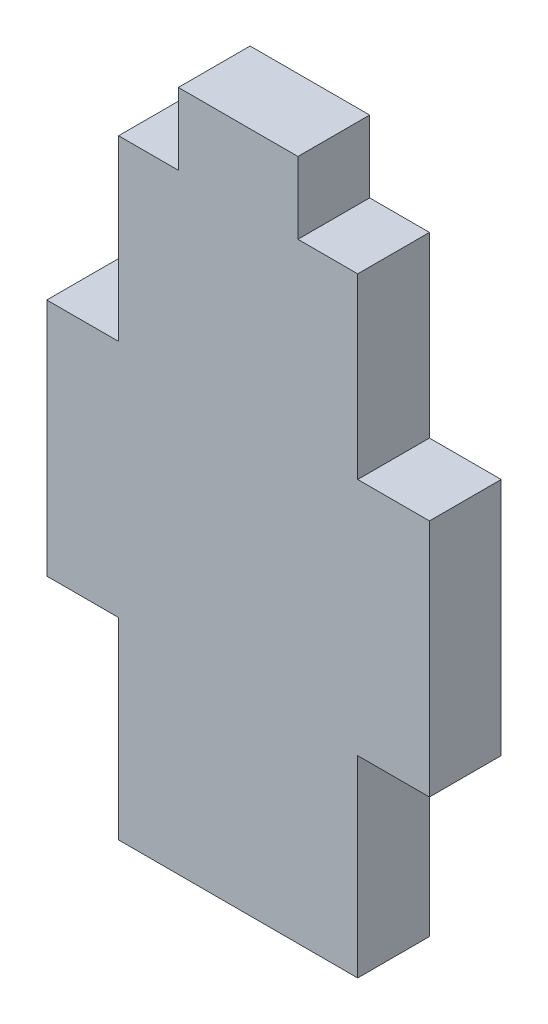
ISO-10303-21;
HEADER;
FILE_DESCRIPTION(('STEP AP214'),'2;1');
FILE_NAME('part.step','',(''),(''),'','','');
FILE_SCHEMA(('AUTOMOTIVE_DESIGN { 1 0 10303 214 1 1 1 1 }'));
ENDSEC;
DATA;
#1=APPLICATION_CONTEXT('core data for automotive mechanical design processes');
#2=APPLICATION_PROTOCOL_DEFINITION('international standard','automotive_design',2000,#1);
#3=PRODUCT_CONTEXT('',#1,'mechanical');
#4=PRODUCT('Part','Part','',(#3));
#5=PRODUCT_RELATED_PRODUCT_CATEGORY('part','',(#4));
#6=PRODUCT_DEFINITION_FORMATION('','',#4);
#7=PRODUCT_DEFINITION_CONTEXT('part definition',#1,'design');
#8=PRODUCT_DEFINITION('design','',#6,#7);
#9=PRODUCT_DEFINITION_SHAPE('','',#8);
#10=(LENGTH_UNIT() NAMED_UNIT(*) SI_UNIT(.MILLI.,.METRE.));
#11=(NAMED_UNIT(*) PLANE_ANGLE_UNIT() SI_UNIT($,.RADIAN.));
#12=(NAMED_UNIT(*) SI_UNIT($,.STERADIAN.) SOLID_ANGLE_UNIT());
#13=UNCERTAINTY_MEASURE_WITH_UNIT(LENGTH_MEASURE(1.E-05),#10,'distance_accuracy_value','');
#14=(GEOMETRIC_REPRESENTATION_CONTEXT(3) GLOBAL_UNCERTAINTY_ASSIGNED_CONTEXT((#13)) GLOBAL_UNIT_ASSIGNED_CONTEXT((#10,
#11,#12)) REPRESENTATION_CONTEXT('',''));
#15=CARTESIAN_POINT('',(0.,0.,0.));
#16=DIRECTION('',(0.,0.,1.));
#17=DIRECTION('',(1.,0.,0.));
#18=AXIS2_PLACEMENT_3D('',#15,#16,#17);
#19=CARTESIAN_POINT('',(0.,0.,0.));
#20=DIRECTION('',(0.,0.,1.));
#21=DIRECTION('',(1.,0.,0.));
#22=AXIS2_PLACEMENT_3D('',#19,#20,#21);
#23=PLANE('',#22);
#24=DIRECTION('',(0.,1.,0.));
#25=VECTOR('',#24,1.);
#26=CARTESIAN_POINT('',(36.4981674922292,0.171613986821683,5.12090370108353E-12));
#27=LINE('',#26,#25);
#28=CARTESIAN_POINT('',(36.4981674922292,10.3396981517135,5.12062148005463E-12));
#29=VERTEX_POINT('',#28);
#30=CARTESIAN_POINT('',(36.4981674922292,18.3922397071632,5.09314812546791E-12));
#31=VERTEX_POINT('',#30);
#32=EDGE_CURVE('E185',#29,#31,#27,.T.);
#33=ORIENTED_EDGE('',*,*,#32,.F.);
#34=DIRECTION('',(1.,0.,0.));
#35=VECTOR('',#34,1.);
#36=CARTESIAN_POINT('',(0.,10.3396981517135,0.));
#37=LINE('',#36,#35);
#38=CARTESIAN_POINT('',(26.4981674922293,10.3396981517135,0.));
#39=VERTEX_POINT('',#38);
#40=EDGE_CURVE('E45',#39,#29,#37,.T.);
#41=ORIENTED_EDGE('',*,*,#40,.F.);
#42=DIRECTION('',(0.,1.,0.));
#43=VECTOR('',#42,1.);
#44=CARTESIAN_POINT('',(26.4981674922293,0.171613986818197,0.));
#45=LINE('',#44,#43);
#46=CARTESIAN_POINT('',(26.4981674922293,18.3922397071597,0.));
#47=VERTEX_POINT('',#46);
#48=EDGE_CURVE('E222',#39,#47,#45,.T.);
#49=ORIENTED_EDGE('',*,*,#48,.T.);
#50=DIRECTION('',(1.,0.,0.));
#51=VECTOR('',#50,1.);
#52=CARTESIAN_POINT('',(23.4981674922293,18.3922397071597,0.));
#53=LINE('',#52,#51);
#54=CARTESIAN_POINT('',(23.4981674922293,18.3922397071597,0.));
#55=VERTEX_POINT('',#54);
#56=EDGE_CURVE('E208',#55,#47,#53,.T.);
#57=ORIENTED_EDGE('',*,*,#56,.F.);
#58=DIRECTION('',(0.,-1.,0.));
#59=VECTOR('',#58,1.);
#60=CARTESIAN_POINT('',(23.4981674922292,0.,0.));
#61=LINE('',#60,#59);
#62=CARTESIAN_POINT('',(23.4981674922293,28.3922397071597,0.));
#63=VERTEX_POINT('',#62);
#64=EDGE_CURVE('E300',#63,#55,#61,.T.);
#65=ORIENTED_EDGE('',*,*,#64,.F.);
#66=DIRECTION('',(1.,0.,0.));
#67=VECTOR('',#66,1.);
#68=CARTESIAN_POINT('',(23.4981674922293,28.3922397071597,0.));
#69=LINE('',#68,#67);
#70=CARTESIAN_POINT('',(26.4981674922293,28.3922397071597,0.));
#71=VERTEX_POINT('',#70);
#72=EDGE_CURVE('E201',#63,#71,#69,.T.);
#73=ORIENTED_EDGE('',*,*,#72,.T.);
#74=CARTESIAN_POINT('',(26.4981674922293,35.8396981517169,0.));
#75=VERTEX_POINT('',#74);
#76=EDGE_CURVE('E211',#71,#75,#45,.T.);
#77=ORIENTED_EDGE('',*,*,#76,.T.);
#78=DIRECTION('',(-1.,0.,0.));
#79=VECTOR('',#78,1.);
#80=CARTESIAN_POINT('',(0.658469340515729,35.8396981517169,5.11396480717963E-12));
#81=LINE('',#80,#79);
#82=CARTESIAN_POINT('',(28.9981674922292,35.8396981517169,5.11049536022767E-12));
#83=VERTEX_POINT('',#82);
#84=EDGE_CURVE('E265',#83,#75,#81,.T.);
#85=ORIENTED_EDGE('',*,*,#84,.F.);
#86=DIRECTION('',(0.,-1.,0.));
#87=VECTOR('',#86,1.);
#88=CARTESIAN_POINT('',(28.9981674922292,38.8396981517169,5.11049536022767E-12));
#89=LINE('',#88,#87);
#90=CARTESIAN_POINT('',(28.9981674922292,38.8396981517135,0.));
#91=VERTEX_POINT('',#90);
#92=EDGE_CURVE('E269',#91,#83,#89,.T.);
#93=ORIENTED_EDGE('',*,*,#92,.F.);
#94=DIRECTION('',(1.,0.,0.));
#95=VECTOR('',#94,1.);
#96=CARTESIAN_POINT('',(0.,38.8396981517135,0.));
#97=LINE('',#96,#95);
#98=CARTESIAN_POINT('',(33.9981674922292,38.8396981517169,5.11049536022767E-12));
#99=VERTEX_POINT('',#98);
#100=EDGE_CURVE('E297',#91,#99,#97,.T.);
#101=ORIENTED_EDGE('',*,*,#100,.T.);
#102=DIRECTION('',(0.,-1.,0.));
#103=VECTOR('',#102,1.);
#104=CARTESIAN_POINT('',(33.9981674922292,38.8396981517169,5.11049536022767E-12));
#105=LINE('',#104,#103);
#106=CARTESIAN_POINT('',(33.9981674922292,35.8396981517169,0.));
#107=VERTEX_POINT('',#106);
#108=EDGE_CURVE('E266',#99,#107,#105,.T.);
#109=ORIENTED_EDGE('',*,*,#108,.T.);
#110=CARTESIAN_POINT('',(36.4981674922292,35.8396981517169,5.11049536022767E-12));
#111=VERTEX_POINT('',#110);
#112=EDGE_CURVE('E183',#111,#107,#81,.T.);
#113=ORIENTED_EDGE('',*,*,#112,.F.);
#114=CARTESIAN_POINT('',(36.4981674922292,28.3922397071632,5.09314812546791E-12));
#115=VERTEX_POINT('',#114);
#116=EDGE_CURVE('E160',#115,#111,#27,.T.);
#117=ORIENTED_EDGE('',*,*,#116,.F.);
#118=DIRECTION('',(1.,0.,0.));
#119=VECTOR('',#118,1.);
#120=CARTESIAN_POINT('',(36.4981674922292,28.3922397071632,5.09314812546791E-12));
#121=LINE('',#120,#119);
#122=CARTESIAN_POINT('',(39.4981674922292,28.3922397071632,5.09314812546791E-12));
#123=VERTEX_POINT('',#122);
#124=EDGE_CURVE('E170',#115,#123,#121,.T.);
#125=ORIENTED_EDGE('',*,*,#124,.T.);
#126=DIRECTION('',(0.,-1.,0.));
#127=VECTOR('',#126,1.);
#128=CARTESIAN_POINT('',(39.4981674922292,0.,0.));
#129=LINE('',#128,#127);
#130=CARTESIAN_POINT('',(39.4981674922292,18.3922397071632,5.09314812546791E-12));
#131=VERTEX_POINT('',#130);
#132=EDGE_CURVE('E294',#123,#131,#129,.T.);
#133=ORIENTED_EDGE('',*,*,#132,.T.);
#134=DIRECTION('',(1.,0.,0.));
#135=VECTOR('',#134,1.);
#136=CARTESIAN_POINT('',(36.4981674922292,18.3922397071632,5.09314812546791E-12));
#137=LINE('',#136,#135);
#138=EDGE_CURVE('E186',#31,#131,#137,.T.);
#139=ORIENTED_EDGE('',*,*,#138,.F.);
#140=EDGE_LOOP('',(#33,#41,#49,#57,#65,#73,#77,#85,#93,#101,#109,#113,#117,#125,#133,#139));
#141=FACE_BOUND('',#140,.T.);
#142=ADVANCED_FACE('F41',(#141),#23,.F.);
#143=CARTESIAN_POINT('',(39.4981674922292,0.,3.));
#144=DIRECTION('',(1.,0.,0.));
#145=DIRECTION('',(0.,1.,0.));
#146=AXIS2_PLACEMENT_3D('',#143,#144,#145);
#147=PLANE('',#146);
#148=DIRECTION('',(0.,-1.,0.));
#149=VECTOR('',#148,1.);
#150=CARTESIAN_POINT('',(39.4981674922292,0.,3.));
#151=LINE('',#150,#149);
#152=CARTESIAN_POINT('',(39.4981674922292,28.3922397071632,3.00000000000512));
#153=VERTEX_POINT('',#152);
#154=CARTESIAN_POINT('',(39.4981674922292,18.3922397071632,3.));
#155=VERTEX_POINT('',#154);
#156=EDGE_CURVE('E283',#153,#155,#151,.T.);
#157=ORIENTED_EDGE('',*,*,#156,.T.);
#158=DIRECTION('',(0.,0.,-1.));
#159=VECTOR('',#158,1.);
#160=CARTESIAN_POINT('',(39.4981674922292,18.3922397071632,5.09314812546791E-12));
#161=LINE('',#160,#159);
#162=EDGE_CURVE('E67',#155,#131,#161,.T.);
#163=ORIENTED_EDGE('',*,*,#162,.T.);
#164=ORIENTED_EDGE('',*,*,#132,.F.);
#165=DIRECTION('',(0.,0.,1.));
#166=VECTOR('',#165,1.);
#167=CARTESIAN_POINT('',(39.4981674922292,28.3922397071632,5.09314812546791E-12));
#168=LINE('',#167,#166);
#169=EDGE_CURVE('E173',#123,#153,#168,.T.);
#170=ORIENTED_EDGE('',*,*,#169,.T.);
#171=EDGE_LOOP('',(#157,#163,#164,#170));
#172=FACE_BOUND('',#171,.T.);
#173=ADVANCED_FACE('F43',(#172),#147,.T.);
#174=CARTESIAN_POINT('',(23.4981674922292,0.,3.));
#175=DIRECTION('',(1.,0.,0.));
#176=DIRECTION('',(0.,0.,-1.));
#177=AXIS2_PLACEMENT_3D('',#174,#175,#176);
#178=PLANE('',#177);
#179=DIRECTION('',(0.,0.,-1.));
#180=VECTOR('',#179,1.);
#181=CARTESIAN_POINT('',(23.4981674922293,18.3922397071597,0.));
#182=LINE('',#181,#180);
#183=CARTESIAN_POINT('',(23.4981674922293,18.3922397071597,2.99999999999997));
#184=VERTEX_POINT('',#183);
#185=EDGE_CURVE('E198',#184,#55,#182,.T.);
#186=ORIENTED_EDGE('',*,*,#185,.F.);
#187=DIRECTION('',(0.,-1.,0.));
#188=VECTOR('',#187,1.);
#189=CARTESIAN_POINT('',(23.4981674922292,0.,3.));
#190=LINE('',#189,#188);
#191=CARTESIAN_POINT('',(23.4981674922293,28.3922397071597,2.99999999999997));
#192=VERTEX_POINT('',#191);
#193=EDGE_CURVE('E51',#192,#184,#190,.T.);
#194=ORIENTED_EDGE('',*,*,#193,.F.);
#195=DIRECTION('',(0.,0.,1.));
#196=VECTOR('',#195,1.);
#197=CARTESIAN_POINT('',(23.4981674922293,28.3922397071597,0.));
#198=LINE('',#197,#196);
#199=EDGE_CURVE('E195',#63,#192,#198,.T.);
#200=ORIENTED_EDGE('',*,*,#199,.F.);
#201=ORIENTED_EDGE('',*,*,#64,.T.);
#202=EDGE_LOOP('',(#186,#194,#200,#201));
#203=FACE_BOUND('',#202,.T.);
#204=ADVANCED_FACE('F365',(#203),#178,.F.);
#205=CARTESIAN_POINT('',(0.,10.3396981517135,3.));
#206=DIRECTION('',(0.,1.,0.));
#207=DIRECTION('',(0.,0.,1.));
#208=AXIS2_PLACEMENT_3D('',#205,#206,#207);
#209=PLANE('',#208);
#210=DIRECTION('',(0.,0.,-1.));
#211=VECTOR('',#210,1.);
#212=CARTESIAN_POINT('',(36.4981674922292,10.3396981517135,3.));
#213=LINE('',#212,#211);
#214=CARTESIAN_POINT('',(36.4981674922292,10.3396981517135,3.));
#215=VERTEX_POINT('',#214);
#216=EDGE_CURVE('E235',#215,#29,#213,.T.);
#217=ORIENTED_EDGE('',*,*,#216,.F.);
#218=DIRECTION('',(1.,0.,0.));
#219=VECTOR('',#218,1.);
#220=CARTESIAN_POINT('',(0.,10.3396981517135,3.));
#221=LINE('',#220,#219);
#222=CARTESIAN_POINT('',(26.4981674922293,10.3396981517135,3.));
#223=VERTEX_POINT('',#222);
#224=EDGE_CURVE('E11',#223,#215,#221,.T.);
#225=ORIENTED_EDGE('',*,*,#224,.F.);
#226=DIRECTION('',(0.,0.,-1.));
#227=VECTOR('',#226,1.);
#228=CARTESIAN_POINT('',(26.4981674922293,10.3396981517135,3.));
#229=LINE('',#228,#227);
#230=EDGE_CURVE('E242',#223,#39,#229,.T.);
#231=ORIENTED_EDGE('',*,*,#230,.T.);
#232=ORIENTED_EDGE('',*,*,#40,.T.);
#233=EDGE_LOOP('',(#217,#225,#231,#232));
#234=FACE_BOUND('',#233,.T.);
#235=ADVANCED_FACE('F312',(#234),#209,.F.);
#236=CARTESIAN_POINT('',(0.,0.,3.));
#237=DIRECTION('',(0.,0.,1.));
#238=DIRECTION('',(1.,0.,0.));
#239=AXIS2_PLACEMENT_3D('',#236,#237,#238);
#240=PLANE('',#239);
#241=DIRECTION('',(1.,0.,0.));
#242=VECTOR('',#241,1.);
#243=CARTESIAN_POINT('',(23.4981674922293,18.3922397071597,2.99999999999997));
#244=LINE('',#243,#242);
#245=CARTESIAN_POINT('',(26.4981674922293,18.3922397071597,3.));
#246=VERTEX_POINT('',#245);
#247=EDGE_CURVE('E212',#184,#246,#244,.T.);
#248=ORIENTED_EDGE('',*,*,#247,.T.);
#249=DIRECTION('',(0.,1.,0.));
#250=VECTOR('',#249,1.);
#251=CARTESIAN_POINT('',(26.4981674922293,0.,3.));
#252=LINE('',#251,#250);
#253=EDGE_CURVE('E241',#223,#246,#252,.T.);
#254=ORIENTED_EDGE('',*,*,#253,.F.);
#255=ORIENTED_EDGE('',*,*,#224,.T.);
#256=DIRECTION('',(0.,1.,0.));
#257=VECTOR('',#256,1.);
#258=CARTESIAN_POINT('',(36.4981674922292,0.,3.));
#259=LINE('',#258,#257);
#260=CARTESIAN_POINT('',(36.4981674922292,18.3922397071632,3.00000000000512));
#261=VERTEX_POINT('',#260);
#262=EDGE_CURVE('E234',#215,#261,#259,.T.);
#263=ORIENTED_EDGE('',*,*,#262,.T.);
#264=DIRECTION('',(1.,0.,0.));
#265=VECTOR('',#264,1.);
#266=CARTESIAN_POINT('',(36.4981674922292,18.3922397071632,3.00000000000512));
#267=LINE('',#266,#265);
#268=EDGE_CURVE('E191',#261,#155,#267,.T.);
#269=ORIENTED_EDGE('',*,*,#268,.T.);
#270=ORIENTED_EDGE('',*,*,#156,.F.);
#271=DIRECTION('',(1.,0.,0.));
#272=VECTOR('',#271,1.);
#273=CARTESIAN_POINT('',(36.4981674922292,28.3922397071632,3.00000000000512));
#274=LINE('',#273,#272);
#275=CARTESIAN_POINT('',(36.4981674922292,28.3922397071632,3.00000000000512));
#276=VERTEX_POINT('',#275);
#277=EDGE_CURVE('E178',#276,#153,#274,.T.);
#278=ORIENTED_EDGE('',*,*,#277,.F.);
#279=CARTESIAN_POINT('',(36.4981674922292,35.8396981517169,3.00000000000511));
#280=VERTEX_POINT('',#279);
#281=EDGE_CURVE('E163',#276,#280,#259,.T.);
#282=ORIENTED_EDGE('',*,*,#281,.T.);
#283=DIRECTION('',(1.,0.,0.));
#284=VECTOR('',#283,1.);
#285=CARTESIAN_POINT('',(0.,35.8396981517169,3.));
#286=LINE('',#285,#284);
#287=CARTESIAN_POINT('',(33.9981674922292,35.8396981517169,3.00000000000511));
#288=VERTEX_POINT('',#287);
#289=EDGE_CURVE('E278',#288,#280,#286,.T.);
#290=ORIENTED_EDGE('',*,*,#289,.F.);
#291=DIRECTION('',(0.,-1.,0.));
#292=VECTOR('',#291,1.);
#293=CARTESIAN_POINT('',(33.9981674922292,38.8396981517169,3.00000000000511));
#294=LINE('',#293,#292);
#295=CARTESIAN_POINT('',(33.9981674922292,38.8396981517169,3.00000000000511));
#296=VERTEX_POINT('',#295);
#297=EDGE_CURVE('E261',#296,#288,#294,.T.);
#298=ORIENTED_EDGE('',*,*,#297,.F.);
#299=DIRECTION('',(1.,0.,0.));
#300=VECTOR('',#299,1.);
#301=CARTESIAN_POINT('',(0.,38.8396981517135,3.));
#302=LINE('',#301,#300);
#303=CARTESIAN_POINT('',(28.9981674922292,38.8396981517169,3.00000000000511));
#304=VERTEX_POINT('',#303);
#305=EDGE_CURVE('E287',#304,#296,#302,.T.);
#306=ORIENTED_EDGE('',*,*,#305,.F.);
#307=DIRECTION('',(0.,-1.,0.));
#308=VECTOR('',#307,1.);
#309=CARTESIAN_POINT('',(28.9981674922292,38.8396981517169,3.00000000000511));
#310=LINE('',#309,#308);
#311=CARTESIAN_POINT('',(28.9981674922292,35.8396981517169,3.00000000000511));
#312=VERTEX_POINT('',#311);
#313=EDGE_CURVE('E255',#304,#312,#310,.T.);
#314=ORIENTED_EDGE('',*,*,#313,.T.);
#315=CARTESIAN_POINT('',(26.4981674922292,35.8396981517169,3.));
#316=VERTEX_POINT('',#315);
#317=EDGE_CURVE('E282',#316,#312,#286,.T.);
#318=ORIENTED_EDGE('',*,*,#317,.F.);
#319=CARTESIAN_POINT('',(26.4981674922293,28.3922397071597,2.99999999999997));
#320=VERTEX_POINT('',#319);
#321=EDGE_CURVE('E238',#320,#316,#252,.T.);
#322=ORIENTED_EDGE('',*,*,#321,.F.);
#323=DIRECTION('',(1.,0.,0.));
#324=VECTOR('',#323,1.);
#325=CARTESIAN_POINT('',(23.4981674922293,28.3922397071597,2.99999999999997));
#326=LINE('',#325,#324);
#327=EDGE_CURVE('E216',#192,#320,#326,.T.);
#328=ORIENTED_EDGE('',*,*,#327,.F.);
#329=ORIENTED_EDGE('',*,*,#193,.T.);
#330=EDGE_LOOP('',(#248,#254,#255,#263,#269,#270,#278,#282,#290,#298,#306,#314,#318,#322,#328,#329));
#331=FACE_BOUND('',#330,.T.);
#332=ADVANCED_FACE('F334',(#331),#240,.T.);
#333=CARTESIAN_POINT('',(0.,38.8396981517135,3.));
#334=DIRECTION('',(0.,1.,0.));
#335=DIRECTION('',(0.,0.,1.));
#336=AXIS2_PLACEMENT_3D('',#333,#334,#335);
#337=PLANE('',#336);
#338=DIRECTION('',(0.,0.,-1.));
#339=VECTOR('',#338,1.);
#340=CARTESIAN_POINT('',(33.9981674922291,38.8396981517169,19.2500000000052));
#341=LINE('',#340,#339);
#342=EDGE_CURVE('E250',#296,#99,#341,.T.);
#343=ORIENTED_EDGE('',*,*,#342,.T.);
#344=ORIENTED_EDGE('',*,*,#100,.F.);
#345=DIRECTION('',(0.,0.,-1.));
#346=VECTOR('',#345,1.);
#347=CARTESIAN_POINT('',(28.9981674922292,38.8396981517169,19.2500000000051));
#348=LINE('',#347,#346);
#349=EDGE_CURVE('E247',#304,#91,#348,.T.);
#350=ORIENTED_EDGE('',*,*,#349,.F.);
#351=ORIENTED_EDGE('',*,*,#305,.T.);
#352=EDGE_LOOP('',(#343,#344,#350,#351));
#353=FACE_BOUND('',#352,.T.);
#354=ADVANCED_FACE('F355',(#353),#337,.T.);
#355=CARTESIAN_POINT('',(28.9981674922292,38.8396981517169,19.2500000000051));
#356=DIRECTION('',(-1.,0.,0.));
#357=DIRECTION('',(0.,0.,-1.));
#358=AXIS2_PLACEMENT_3D('',#355,#356,#357);
#359=PLANE('',#358);
#360=DIRECTION('',(0.,0.,-1.));
#361=VECTOR('',#360,1.);
#362=CARTESIAN_POINT('',(28.9981674922292,35.8396981517169,19.2500000000051));
#363=LINE('',#362,#361);
#364=EDGE_CURVE('E246',#312,#83,#363,.T.);
#365=ORIENTED_EDGE('',*,*,#364,.F.);
#366=ORIENTED_EDGE('',*,*,#313,.F.);
#367=ORIENTED_EDGE('',*,*,#349,.T.);
#368=ORIENTED_EDGE('',*,*,#92,.T.);
#369=EDGE_LOOP('',(#365,#366,#367,#368));
#370=FACE_BOUND('',#369,.T.);
#371=ADVANCED_FACE('F347',(#370),#359,.T.);
#372=CARTESIAN_POINT('',(0.658469340515732,35.8396981517169,19.2500000000051));
#373=DIRECTION('',(0.,-1.,0.));
#374=DIRECTION('',(0.,0.,-1.));
#375=AXIS2_PLACEMENT_3D('',#372,#373,#374);
#376=PLANE('',#375);
#377=ORIENTED_EDGE('',*,*,#317,.T.);
#378=ORIENTED_EDGE('',*,*,#364,.T.);
#379=ORIENTED_EDGE('',*,*,#84,.T.);
#380=DIRECTION('',(0.,0.,1.));
#381=VECTOR('',#380,1.);
#382=CARTESIAN_POINT('',(26.4981674922293,35.8396981517169,19.2500000000051));
#383=LINE('',#382,#381);
#384=EDGE_CURVE('E190',#75,#316,#383,.T.);
#385=ORIENTED_EDGE('',*,*,#384,.T.);
#386=EDGE_LOOP('',(#377,#378,#379,#385));
#387=FACE_BOUND('',#386,.T.);
#388=ADVANCED_FACE('F344',(#387),#376,.F.);
#389=ORIENTED_EDGE('',*,*,#289,.T.);
#390=DIRECTION('',(0.,0.,1.));
#391=VECTOR('',#390,1.);
#392=CARTESIAN_POINT('',(36.4981674922292,35.8396981517169,19.2500000000051));
#393=LINE('',#392,#391);
#394=EDGE_CURVE('E226',#111,#280,#393,.T.);
#395=ORIENTED_EDGE('',*,*,#394,.F.);
#396=ORIENTED_EDGE('',*,*,#112,.T.);
#397=DIRECTION('',(0.,0.,-1.));
#398=VECTOR('',#397,1.);
#399=CARTESIAN_POINT('',(33.9981674922292,35.8396981517169,19.2500000000052));
#400=LINE('',#399,#398);
#401=EDGE_CURVE('E251',#288,#107,#400,.T.);
#402=ORIENTED_EDGE('',*,*,#401,.F.);
#403=EDGE_LOOP('',(#389,#395,#396,#402));
#404=FACE_BOUND('',#403,.T.);
#405=ADVANCED_FACE('F430',(#404),#376,.F.);
#406=CARTESIAN_POINT('',(33.9981674922291,38.8396981517169,19.2500000000052));
#407=DIRECTION('',(-1.,0.,0.));
#408=DIRECTION('',(0.,0.,-1.));
#409=AXIS2_PLACEMENT_3D('',#406,#407,#408);
#410=PLANE('',#409);
#411=ORIENTED_EDGE('',*,*,#401,.T.);
#412=ORIENTED_EDGE('',*,*,#108,.F.);
#413=ORIENTED_EDGE('',*,*,#342,.F.);
#414=ORIENTED_EDGE('',*,*,#297,.T.);
#415=EDGE_LOOP('',(#411,#412,#413,#414));
#416=FACE_BOUND('',#415,.T.);
#417=ADVANCED_FACE('F449',(#416),#410,.F.);
#418=CARTESIAN_POINT('',(36.4981674922292,0.171613986821685,32.5000000000051));
#419=DIRECTION('',(1.,0.,0.));
#420=DIRECTION('',(0.,-1.,0.));
#421=AXIS2_PLACEMENT_3D('',#418,#419,#420);
#422=PLANE('',#421);
#423=DIRECTION('',(0.,0.,1.));
#424=VECTOR('',#423,1.);
#425=CARTESIAN_POINT('',(36.4981674922292,28.3922397071632,5.09314812546791E-12));
#426=LINE('',#425,#424);
#427=EDGE_CURVE('E156',#115,#276,#426,.T.);
#428=ORIENTED_EDGE('',*,*,#427,.F.);
#429=ORIENTED_EDGE('',*,*,#116,.T.);
#430=ORIENTED_EDGE('',*,*,#394,.T.);
#431=ORIENTED_EDGE('',*,*,#281,.F.);
#432=EDGE_LOOP('',(#428,#429,#430,#431));
#433=FACE_BOUND('',#432,.T.);
#434=ADVANCED_FACE('F158',(#433),#422,.T.);
#435=CARTESIAN_POINT('',(36.4981674922292,28.3922397071632,5.09314812546791E-12));
#436=DIRECTION('',(0.,1.,0.));
#437=DIRECTION('',(0.,0.,1.));
#438=AXIS2_PLACEMENT_3D('',#435,#436,#437);
#439=PLANE('',#438);
#440=ORIENTED_EDGE('',*,*,#169,.F.);
#441=ORIENTED_EDGE('',*,*,#124,.F.);
#442=ORIENTED_EDGE('',*,*,#427,.T.);
#443=ORIENTED_EDGE('',*,*,#277,.T.);
#444=EDGE_LOOP('',(#440,#441,#442,#443));
#445=FACE_BOUND('',#444,.T.);
#446=ADVANCED_FACE('F171',(#445),#439,.T.);
#447=CARTESIAN_POINT('',(26.4981674922293,0.171613986818198,32.5));
#448=DIRECTION('',(1.,0.,0.));
#449=DIRECTION('',(0.,-1.,0.));
#450=AXIS2_PLACEMENT_3D('',#447,#448,#449);
#451=PLANE('',#450);
#452=ORIENTED_EDGE('',*,*,#321,.T.);
#453=ORIENTED_EDGE('',*,*,#384,.F.);
#454=ORIENTED_EDGE('',*,*,#76,.F.);
#455=DIRECTION('',(0.,0.,1.));
#456=VECTOR('',#455,1.);
#457=CARTESIAN_POINT('',(26.4981674922293,28.3922397071597,0.));
#458=LINE('',#457,#456);
#459=EDGE_CURVE('E202',#71,#320,#458,.T.);
#460=ORIENTED_EDGE('',*,*,#459,.T.);
#461=EDGE_LOOP('',(#452,#453,#454,#460));
#462=FACE_BOUND('',#461,.T.);
#463=ADVANCED_FACE('F361',(#462),#451,.F.);
#464=CARTESIAN_POINT('',(23.4981674922293,28.3922397071597,0.));
#465=DIRECTION('',(0.,1.,0.));
#466=DIRECTION('',(0.,0.,1.));
#467=AXIS2_PLACEMENT_3D('',#464,#465,#466);
#468=PLANE('',#467);
#469=ORIENTED_EDGE('',*,*,#459,.F.);
#470=ORIENTED_EDGE('',*,*,#72,.F.);
#471=ORIENTED_EDGE('',*,*,#199,.T.);
#472=ORIENTED_EDGE('',*,*,#327,.T.);
#473=EDGE_LOOP('',(#469,#470,#471,#472));
#474=FACE_BOUND('',#473,.T.);
#475=ADVANCED_FACE('F370',(#474),#468,.T.);
#476=ORIENTED_EDGE('',*,*,#253,.T.);
#477=DIRECTION('',(0.,0.,-1.));
#478=VECTOR('',#477,1.);
#479=CARTESIAN_POINT('',(26.4981674922293,18.3922397071597,0.));
#480=LINE('',#479,#478);
#481=EDGE_CURVE('E59',#246,#47,#480,.T.);
#482=ORIENTED_EDGE('',*,*,#481,.T.);
#483=ORIENTED_EDGE('',*,*,#48,.F.);
#484=ORIENTED_EDGE('',*,*,#230,.F.);
#485=EDGE_LOOP('',(#476,#482,#483,#484));
#486=FACE_BOUND('',#485,.T.);
#487=ADVANCED_FACE('F368',(#486),#451,.F.);
#488=CARTESIAN_POINT('',(23.4981674922293,18.3922397071597,0.));
#489=DIRECTION('',(0.,-1.,0.));
#490=DIRECTION('',(0.,0.,-1.));
#491=AXIS2_PLACEMENT_3D('',#488,#489,#490);
#492=PLANE('',#491);
#493=ORIENTED_EDGE('',*,*,#481,.F.);
#494=ORIENTED_EDGE('',*,*,#247,.F.);
#495=ORIENTED_EDGE('',*,*,#185,.T.);
#496=ORIENTED_EDGE('',*,*,#56,.T.);
#497=EDGE_LOOP('',(#493,#494,#495,#496));
#498=FACE_BOUND('',#497,.T.);
#499=ADVANCED_FACE('F366',(#498),#492,.T.);
#500=ORIENTED_EDGE('',*,*,#216,.T.);
#501=ORIENTED_EDGE('',*,*,#32,.T.);
#502=DIRECTION('',(0.,0.,-1.));
#503=VECTOR('',#502,1.);
#504=CARTESIAN_POINT('',(36.4981674922292,18.3922397071632,5.09314812546791E-12));
#505=LINE('',#504,#503);
#506=EDGE_CURVE('E167',#261,#31,#505,.T.);
#507=ORIENTED_EDGE('',*,*,#506,.F.);
#508=ORIENTED_EDGE('',*,*,#262,.F.);
#509=EDGE_LOOP('',(#500,#501,#507,#508));
#510=FACE_BOUND('',#509,.T.);
#511=ADVANCED_FACE('F319',(#510),#422,.T.);
#512=CARTESIAN_POINT('',(36.4981674922292,18.3922397071632,5.09314812546791E-12));
#513=DIRECTION('',(0.,-1.,0.));
#514=DIRECTION('',(0.,0.,-1.));
#515=AXIS2_PLACEMENT_3D('',#512,#513,#514);
#516=PLANE('',#515);
#517=ORIENTED_EDGE('',*,*,#162,.F.);
#518=ORIENTED_EDGE('',*,*,#268,.F.);
#519=ORIENTED_EDGE('',*,*,#506,.T.);
#520=ORIENTED_EDGE('',*,*,#138,.T.);
#521=EDGE_LOOP('',(#517,#518,#519,#520));
#522=FACE_BOUND('',#521,.T.);
#523=ADVANCED_FACE('F321',(#522),#516,.T.);
#524=CLOSED_SHELL('',(#142,#173,#204,#235,#332,#354,#371,#388,#405,#417,#434,#446,#463,#475,
#487,#499,#511,#523));
#525=MANIFOLD_SOLID_BREP('B2',#524);
#526=ADVANCED_BREP_SHAPE_REPRESENTATION('',(#18,#525),#14);
#527=SHAPE_DEFINITION_REPRESENTATION(#9,#526);
ENDSEC;
END-ISO-10303-21;
